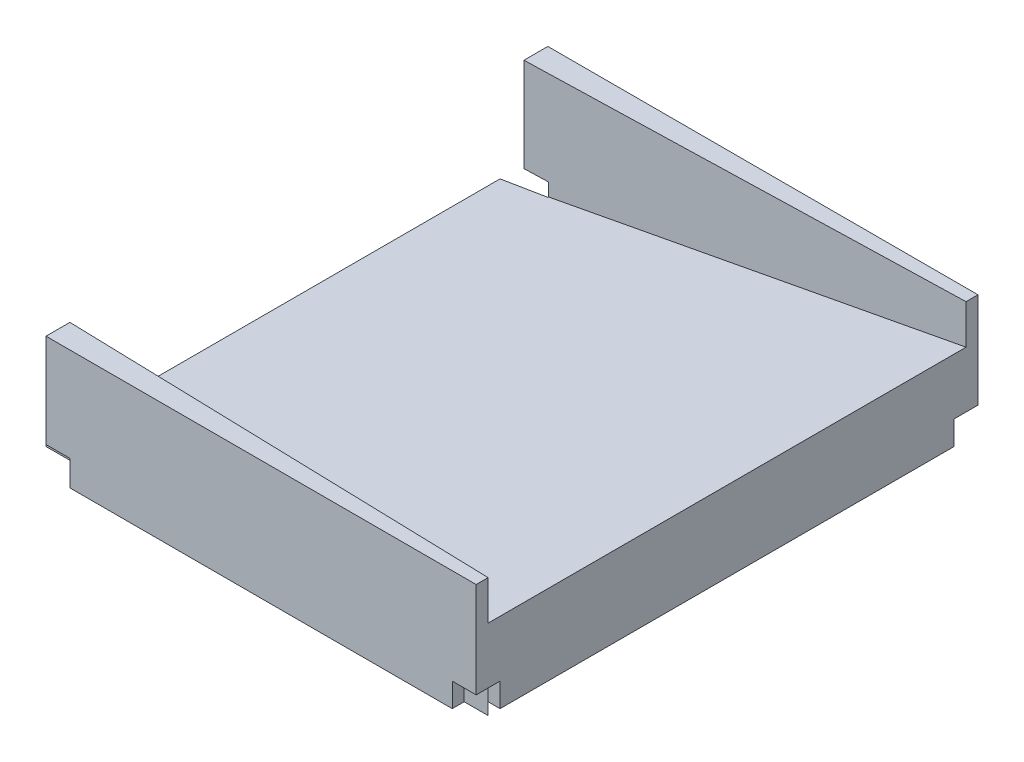
ISO-10303-21;
HEADER;
FILE_DESCRIPTION(('STEP AP214'),'2;1');
FILE_NAME('part.step','',(''),(''),'','','');
FILE_SCHEMA(('AUTOMOTIVE_DESIGN { 1 0 10303 214 1 1 1 1 }'));
ENDSEC;
DATA;
#1=APPLICATION_CONTEXT('core data for automotive mechanical design processes');
#2=APPLICATION_PROTOCOL_DEFINITION('international standard','automotive_design',2000,#1);
#3=PRODUCT_CONTEXT('',#1,'mechanical');
#4=PRODUCT('Part','Part','',(#3));
#5=PRODUCT_RELATED_PRODUCT_CATEGORY('part','',(#4));
#6=PRODUCT_DEFINITION_FORMATION('','',#4);
#7=PRODUCT_DEFINITION_CONTEXT('part definition',#1,'design');
#8=PRODUCT_DEFINITION('design','',#6,#7);
#9=PRODUCT_DEFINITION_SHAPE('','',#8);
#10=(LENGTH_UNIT() NAMED_UNIT(*) SI_UNIT(.MILLI.,.METRE.));
#11=(NAMED_UNIT(*) PLANE_ANGLE_UNIT() SI_UNIT($,.RADIAN.));
#12=(NAMED_UNIT(*) SI_UNIT($,.STERADIAN.) SOLID_ANGLE_UNIT());
#13=UNCERTAINTY_MEASURE_WITH_UNIT(LENGTH_MEASURE(1.E-05),#10,'distance_accuracy_value','');
#14=(GEOMETRIC_REPRESENTATION_CONTEXT(3) GLOBAL_UNCERTAINTY_ASSIGNED_CONTEXT((#13)) GLOBAL_UNIT_ASSIGNED_CONTEXT((#10,
#11,#12)) REPRESENTATION_CONTEXT('',''));
#15=CARTESIAN_POINT('',(0.,0.,0.));
#16=DIRECTION('',(0.,0.,1.));
#17=DIRECTION('',(1.,0.,0.));
#18=AXIS2_PLACEMENT_3D('',#15,#16,#17);
#19=CARTESIAN_POINT('',(-105.796013404709,2.,200.));
#20=DIRECTION('',(0.163567680624933,-0.986532114963816,0.));
#21=DIRECTION('',(0.986532114963816,0.163567680624933,0.));
#22=AXIS2_PLACEMENT_3D('',#19,#20,#21);
#23=PLANE('',#22);
#24=DIRECTION('',(0.,0.,-1.));
#25=VECTOR('',#24,1.);
#26=CARTESIAN_POINT('',(-85.7960134047091,5.31601329837969,200.));
#27=LINE('',#26,#25);
#28=CARTESIAN_POINT('',(-85.7960134047091,5.31601329837969,195.277777777778));
#29=VERTEX_POINT('',#28);
#30=CARTESIAN_POINT('',(-85.7960134047091,5.31601329837969,195.));
#31=VERTEX_POINT('',#30);
#32=EDGE_CURVE('E252',#29,#31,#27,.T.);
#33=ORIENTED_EDGE('',*,*,#32,.F.);
#34=DIRECTION('',(-0.986161899831777,-0.163506298709877,-0.0273933861064383));
#35=VECTOR('',#34,1.);
#36=CARTESIAN_POINT('',(-105.653437860258,2.02363912007125,194.726182654013));
#37=LINE('',#36,#35);
#38=CARTESIAN_POINT('',(84.2039865952909,33.502126334607,200.));
#39=VERTEX_POINT('',#38);
#40=EDGE_CURVE('E257',#39,#29,#37,.T.);
#41=ORIENTED_EDGE('',*,*,#40,.F.);
#42=DIRECTION('',(0.,0.,-1.));
#43=VECTOR('',#42,1.);
#44=CARTESIAN_POINT('',(84.2039865952909,33.502126334607,200.));
#45=LINE('',#44,#43);
#46=CARTESIAN_POINT('',(84.2039865952909,33.502126334607,0.));
#47=VERTEX_POINT('',#46);
#48=EDGE_CURVE('E233',#39,#47,#45,.T.);
#49=ORIENTED_EDGE('',*,*,#48,.T.);
#50=DIRECTION('',(-0.986161899831777,-0.163506298709877,0.0273933861064383));
#51=VECTOR('',#50,1.);
#52=CARTESIAN_POINT('',(-111.056300597368,1.12784088579239,5.42389686646275));
#53=LINE('',#52,#51);
#54=CARTESIAN_POINT('',(-85.7960134047091,5.31601329837969,4.72222222222223));
#55=VERTEX_POINT('',#54);
#56=EDGE_CURVE('E353',#47,#55,#53,.T.);
#57=ORIENTED_EDGE('',*,*,#56,.T.);
#58=DIRECTION('',(0.,0.,1.));
#59=VECTOR('',#58,1.);
#60=CARTESIAN_POINT('',(-85.7960134047091,5.31601329837969,200.));
#61=LINE('',#60,#59);
#62=CARTESIAN_POINT('',(-85.7960134047091,5.31601329837969,5.));
#63=VERTEX_POINT('',#62);
#64=EDGE_CURVE('E294',#55,#63,#61,.T.);
#65=ORIENTED_EDGE('',*,*,#64,.T.);
#66=DIRECTION('',(0.986532114963816,0.163567680624933,0.));
#67=VECTOR('',#66,1.);
#68=CARTESIAN_POINT('',(-105.796013404709,2.,5.));
#69=LINE('',#68,#67);
#70=CARTESIAN_POINT('',(-105.796013404709,2.,5.));
#71=VERTEX_POINT('',#70);
#72=EDGE_CURVE('E289',#71,#63,#69,.T.);
#73=ORIENTED_EDGE('',*,*,#72,.F.);
#74=DIRECTION('',(0.,0.,-1.));
#75=VECTOR('',#74,1.);
#76=CARTESIAN_POINT('',(-105.796013404709,2.,200.));
#77=LINE('',#76,#75);
#78=CARTESIAN_POINT('',(-105.796013404709,2.,195.));
#79=VERTEX_POINT('',#78);
#80=EDGE_CURVE('E239',#79,#71,#77,.T.);
#81=ORIENTED_EDGE('',*,*,#80,.F.);
#82=DIRECTION('',(-0.986532114963816,-0.163567680624933,0.));
#83=VECTOR('',#82,1.);
#84=CARTESIAN_POINT('',(-105.796013404709,2.,195.));
#85=LINE('',#84,#83);
#86=EDGE_CURVE('E209',#31,#79,#85,.T.);
#87=ORIENTED_EDGE('',*,*,#86,.F.);
#88=EDGE_LOOP('',(#33,#41,#49,#57,#65,#73,#81,#87));
#89=FACE_BOUND('',#88,.T.);
#90=ADVANCED_FACE('F35',(#89),#23,.F.);
#91=CARTESIAN_POINT('',(-105.796013404709,0.,200.));
#92=DIRECTION('',(1.,0.,0.));
#93=DIRECTION('',(0.,0.,-1.));
#94=AXIS2_PLACEMENT_3D('',#91,#92,#93);
#95=PLANE('',#94);
#96=DIRECTION('',(0.,1.,0.));
#97=VECTOR('',#96,1.);
#98=CARTESIAN_POINT('',(-105.796013404709,0.,195.));
#99=LINE('',#98,#97);
#100=CARTESIAN_POINT('',(-105.796013404709,0.,195.));
#101=VERTEX_POINT('',#100);
#102=EDGE_CURVE('E202',#101,#79,#99,.T.);
#103=ORIENTED_EDGE('',*,*,#102,.T.);
#104=ORIENTED_EDGE('',*,*,#80,.T.);
#105=DIRECTION('',(0.,1.,0.));
#106=VECTOR('',#105,1.);
#107=CARTESIAN_POINT('',(-105.796013404709,0.,5.));
#108=LINE('',#107,#106);
#109=CARTESIAN_POINT('',(-105.796013404709,0.,5.));
#110=VERTEX_POINT('',#109);
#111=EDGE_CURVE('E226',#110,#71,#108,.T.);
#112=ORIENTED_EDGE('',*,*,#111,.F.);
#113=DIRECTION('',(0.,0.,-1.));
#114=VECTOR('',#113,1.);
#115=CARTESIAN_POINT('',(-105.796013404709,0.,200.));
#116=LINE('',#115,#114);
#117=EDGE_CURVE('E218',#101,#110,#116,.T.);
#118=ORIENTED_EDGE('',*,*,#117,.F.);
#119=EDGE_LOOP('',(#103,#104,#112,#118));
#120=FACE_BOUND('',#119,.T.);
#121=ADVANCED_FACE('F37',(#120),#95,.F.);
#122=CARTESIAN_POINT('',(-105.796013404709,0.,200.));
#123=DIRECTION('',(0.,1.,0.));
#124=DIRECTION('',(0.,0.,1.));
#125=AXIS2_PLACEMENT_3D('',#122,#123,#124);
#126=PLANE('',#125);
#127=DIRECTION('',(0.,0.,1.));
#128=VECTOR('',#127,1.);
#129=CARTESIAN_POINT('',(-85.7960134047091,0.,195.));
#130=LINE('',#129,#128);
#131=CARTESIAN_POINT('',(-85.7960134047091,0.,195.));
#132=VERTEX_POINT('',#131);
#133=CARTESIAN_POINT('',(-85.7960134047091,0.,205.));
#134=VERTEX_POINT('',#133);
#135=EDGE_CURVE('E221',#132,#134,#130,.T.);
#136=ORIENTED_EDGE('',*,*,#135,.F.);
#137=DIRECTION('',(-1.,0.,0.));
#138=VECTOR('',#137,1.);
#139=CARTESIAN_POINT('',(-105.796013404709,0.,195.));
#140=LINE('',#139,#138);
#141=EDGE_CURVE('E206',#132,#101,#140,.T.);
#142=ORIENTED_EDGE('',*,*,#141,.T.);
#143=ORIENTED_EDGE('',*,*,#117,.T.);
#144=DIRECTION('',(-1.,0.,0.));
#145=VECTOR('',#144,1.);
#146=CARTESIAN_POINT('',(-105.796013404709,0.,5.));
#147=LINE('',#146,#145);
#148=CARTESIAN_POINT('',(-85.7960134047091,0.,5.));
#149=VERTEX_POINT('',#148);
#150=EDGE_CURVE('E280',#149,#110,#147,.T.);
#151=ORIENTED_EDGE('',*,*,#150,.F.);
#152=DIRECTION('',(0.,0.,-1.));
#153=VECTOR('',#152,1.);
#154=CARTESIAN_POINT('',(-85.7960134047091,0.,5.));
#155=LINE('',#154,#153);
#156=CARTESIAN_POINT('',(-85.7960134047091,0.,-5.));
#157=VERTEX_POINT('',#156);
#158=EDGE_CURVE('E286',#149,#157,#155,.T.);
#159=ORIENTED_EDGE('',*,*,#158,.T.);
#160=DIRECTION('',(1.,0.,0.));
#161=VECTOR('',#160,1.);
#162=CARTESIAN_POINT('',(-95.7960134047091,0.,-5.));
#163=LINE('',#162,#161);
#164=CARTESIAN_POINT('',(74.2039865952908,0.,-5.));
#165=VERTEX_POINT('',#164);
#166=EDGE_CURVE('E365',#157,#165,#163,.T.);
#167=ORIENTED_EDGE('',*,*,#166,.T.);
#168=DIRECTION('',(0.,0.,-1.));
#169=VECTOR('',#168,1.);
#170=CARTESIAN_POINT('',(74.2039865952909,0.,-5.));
#171=LINE('',#170,#169);
#172=CARTESIAN_POINT('',(74.2039865952909,0.,5.));
#173=VERTEX_POINT('',#172);
#174=EDGE_CURVE('E308',#173,#165,#171,.T.);
#175=ORIENTED_EDGE('',*,*,#174,.F.);
#176=DIRECTION('',(1.,0.,0.));
#177=VECTOR('',#176,1.);
#178=CARTESIAN_POINT('',(74.2039865952909,0.,5.));
#179=LINE('',#178,#177);
#180=CARTESIAN_POINT('',(84.2039865952909,0.,5.));
#181=VERTEX_POINT('',#180);
#182=EDGE_CURVE('E315',#173,#181,#179,.T.);
#183=ORIENTED_EDGE('',*,*,#182,.T.);
#184=DIRECTION('',(0.,0.,-1.));
#185=VECTOR('',#184,1.);
#186=CARTESIAN_POINT('',(84.2039865952909,0.,200.));
#187=LINE('',#186,#185);
#188=CARTESIAN_POINT('',(84.2039865952909,0.,195.));
#189=VERTEX_POINT('',#188);
#190=EDGE_CURVE('E228',#189,#181,#187,.T.);
#191=ORIENTED_EDGE('',*,*,#190,.F.);
#192=DIRECTION('',(1.,0.,0.));
#193=VECTOR('',#192,1.);
#194=CARTESIAN_POINT('',(74.2039865952909,0.,195.));
#195=LINE('',#194,#193);
#196=CARTESIAN_POINT('',(74.2039865952909,0.,195.));
#197=VERTEX_POINT('',#196);
#198=EDGE_CURVE('E336',#197,#189,#195,.T.);
#199=ORIENTED_EDGE('',*,*,#198,.F.);
#200=DIRECTION('',(0.,0.,-1.));
#201=VECTOR('',#200,1.);
#202=CARTESIAN_POINT('',(74.2039865952909,0.,205.));
#203=LINE('',#202,#201);
#204=CARTESIAN_POINT('',(74.2039865952909,0.,199.722222222222));
#205=VERTEX_POINT('',#204);
#206=EDGE_CURVE('E325',#205,#197,#203,.T.);
#207=ORIENTED_EDGE('',*,*,#206,.F.);
#208=DIRECTION('',(-0.999614420652718,0.,-0.0277670672403533));
#209=VECTOR('',#208,1.);
#210=CARTESIAN_POINT('',(-95.7960134047091,0.,195.));
#211=LINE('',#210,#209);
#212=CARTESIAN_POINT('',(84.2039865952909,0.,200.));
#213=VERTEX_POINT('',#212);
#214=EDGE_CURVE('E270',#213,#205,#211,.T.);
#215=ORIENTED_EDGE('',*,*,#214,.F.);
#216=DIRECTION('',(1.,0.,0.));
#217=VECTOR('',#216,1.);
#218=CARTESIAN_POINT('',(84.2039865952909,0.,200.));
#219=LINE('',#218,#217);
#220=CARTESIAN_POINT('',(74.2039865952909,0.,200.));
#221=VERTEX_POINT('',#220);
#222=EDGE_CURVE('E414',#221,#213,#219,.T.);
#223=ORIENTED_EDGE('',*,*,#222,.F.);
#224=CARTESIAN_POINT('',(74.2039865952909,0.,205.));
#225=VERTEX_POINT('',#224);
#226=EDGE_CURVE('E327',#225,#221,#203,.T.);
#227=ORIENTED_EDGE('',*,*,#226,.F.);
#228=DIRECTION('',(1.,0.,0.));
#229=VECTOR('',#228,1.);
#230=CARTESIAN_POINT('',(-95.7960134047091,0.,205.));
#231=LINE('',#230,#229);
#232=EDGE_CURVE('E390',#134,#225,#231,.T.);
#233=ORIENTED_EDGE('',*,*,#232,.F.);
#234=EDGE_LOOP('',(#136,#142,#143,#151,#159,#167,#175,#183,#191,#199,#207,#215,#223,#227,#233));
#235=FACE_BOUND('',#234,.T.);
#236=ADVANCED_FACE('F216',(#235),#126,.F.);
#237=CARTESIAN_POINT('',(-95.7960134047091,0.,205.));
#238=DIRECTION('',(0.,0.,1.));
#239=DIRECTION('',(1.,0.,0.));
#240=AXIS2_PLACEMENT_3D('',#237,#238,#239);
#241=PLANE('',#240);
#242=DIRECTION('',(0.,-1.,0.));
#243=VECTOR('',#242,1.);
#244=CARTESIAN_POINT('',(-95.7960134047091,0.,205.));
#245=LINE('',#244,#243);
#246=CARTESIAN_POINT('',(-95.7960134047091,50.,205.));
#247=VERTEX_POINT('',#246);
#248=CARTESIAN_POINT('',(-95.7960134047091,10.7198341627884,205.));
#249=VERTEX_POINT('',#248);
#250=EDGE_CURVE('E377',#247,#249,#245,.T.);
#251=ORIENTED_EDGE('',*,*,#250,.T.);
#252=DIRECTION('',(1.,0.,0.));
#253=VECTOR('',#252,1.);
#254=CARTESIAN_POINT('',(-105.796013404709,10.7198341627884,205.));
#255=LINE('',#254,#253);
#256=CARTESIAN_POINT('',(-85.7960134047091,10.7198341627884,205.));
#257=VERTEX_POINT('',#256);
#258=EDGE_CURVE('E213',#249,#257,#255,.T.);
#259=ORIENTED_EDGE('',*,*,#258,.T.);
#260=DIRECTION('',(0.,-1.,0.));
#261=VECTOR('',#260,1.);
#262=CARTESIAN_POINT('',(-85.7960134047091,0.,205.));
#263=LINE('',#262,#261);
#264=EDGE_CURVE('E426',#257,#134,#263,.T.);
#265=ORIENTED_EDGE('',*,*,#264,.T.);
#266=ORIENTED_EDGE('',*,*,#232,.T.);
#267=DIRECTION('',(0.,-1.,0.));
#268=VECTOR('',#267,1.);
#269=CARTESIAN_POINT('',(74.2039865952909,0.,205.));
#270=LINE('',#269,#268);
#271=CARTESIAN_POINT('',(74.2039865952909,10.,205.));
#272=VERTEX_POINT('',#271);
#273=EDGE_CURVE('E322',#272,#225,#270,.T.);
#274=ORIENTED_EDGE('',*,*,#273,.F.);
#275=DIRECTION('',(1.,0.,0.));
#276=VECTOR('',#275,1.);
#277=CARTESIAN_POINT('',(74.2039865952909,10.,205.));
#278=LINE('',#277,#276);
#279=CARTESIAN_POINT('',(84.2039865952909,10.,205.));
#280=VERTEX_POINT('',#279);
#281=EDGE_CURVE('E342',#272,#280,#278,.T.);
#282=ORIENTED_EDGE('',*,*,#281,.T.);
#283=DIRECTION('',(0.,-1.,0.));
#284=VECTOR('',#283,1.);
#285=CARTESIAN_POINT('',(84.2039865952909,0.,205.));
#286=LINE('',#285,#284);
#287=CARTESIAN_POINT('',(84.2039865952909,50.,205.));
#288=VERTEX_POINT('',#287);
#289=EDGE_CURVE('E378',#288,#280,#286,.T.);
#290=ORIENTED_EDGE('',*,*,#289,.F.);
#291=DIRECTION('',(1.,0.,0.));
#292=VECTOR('',#291,1.);
#293=CARTESIAN_POINT('',(-95.7960134047091,50.,205.));
#294=LINE('',#293,#292);
#295=EDGE_CURVE('E381',#247,#288,#294,.T.);
#296=ORIENTED_EDGE('',*,*,#295,.F.);
#297=EDGE_LOOP('',(#251,#259,#265,#266,#274,#282,#290,#296));
#298=FACE_BOUND('',#297,.T.);
#299=ADVANCED_FACE('F428',(#298),#241,.T.);
#300=CARTESIAN_POINT('',(-95.7960134047091,0.,0.));
#301=DIRECTION('',(1.,0.,0.));
#302=DIRECTION('',(0.,0.,-1.));
#303=AXIS2_PLACEMENT_3D('',#300,#301,#302);
#304=PLANE('',#303);
#305=DIRECTION('',(0.,0.,-1.));
#306=VECTOR('',#305,1.);
#307=CARTESIAN_POINT('',(-95.7960134047091,10.7198341627884,0.));
#308=LINE('',#307,#306);
#309=CARTESIAN_POINT('',(-95.7960134047091,10.7198341627884,195.));
#310=VERTEX_POINT('',#309);
#311=EDGE_CURVE('E259',#249,#310,#308,.T.);
#312=ORIENTED_EDGE('',*,*,#311,.F.);
#313=ORIENTED_EDGE('',*,*,#250,.F.);
#314=DIRECTION('',(0.,0.,1.));
#315=VECTOR('',#314,1.);
#316=CARTESIAN_POINT('',(-95.7960134047091,50.,200.));
#317=LINE('',#316,#315);
#318=CARTESIAN_POINT('',(-95.7960134047091,50.,195.));
#319=VERTEX_POINT('',#318);
#320=EDGE_CURVE('E374',#319,#247,#317,.T.);
#321=ORIENTED_EDGE('',*,*,#320,.F.);
#322=DIRECTION('',(0.,1.,0.));
#323=VECTOR('',#322,1.);
#324=CARTESIAN_POINT('',(-95.7960134047091,-180.069431053691,195.));
#325=LINE('',#324,#323);
#326=EDGE_CURVE('E405',#310,#319,#325,.T.);
#327=ORIENTED_EDGE('',*,*,#326,.F.);
#328=EDGE_LOOP('',(#312,#313,#321,#327));
#329=FACE_BOUND('',#328,.T.);
#330=ADVANCED_FACE('F461',(#329),#304,.F.);
#331=CARTESIAN_POINT('',(-95.7960134047091,-180.069431053691,195.));
#332=DIRECTION('',(-0.0277670672403533,0.,0.999614420652718));
#333=DIRECTION('',(0.999614420652718,0.,0.0277670672403533));
#334=AXIS2_PLACEMENT_3D('',#331,#332,#333);
#335=PLANE('',#334);
#336=DIRECTION('',(0.999614420652718,0.,0.0277670672403533));
#337=VECTOR('',#336,1.);
#338=CARTESIAN_POINT('',(-95.7960134047091,10.7198341627884,195.));
#339=LINE('',#338,#337);
#340=CARTESIAN_POINT('',(-85.7960134047091,10.7198341627884,195.277777777778));
#341=VERTEX_POINT('',#340);
#342=EDGE_CURVE('E11',#310,#341,#339,.T.);
#343=ORIENTED_EDGE('',*,*,#342,.F.);
#344=ORIENTED_EDGE('',*,*,#326,.T.);
#345=DIRECTION('',(0.999614420652718,0.,0.0277670672403533));
#346=VECTOR('',#345,1.);
#347=CARTESIAN_POINT('',(-95.7960134047091,50.,195.));
#348=LINE('',#347,#346);
#349=CARTESIAN_POINT('',(84.2039865952909,50.,200.));
#350=VERTEX_POINT('',#349);
#351=EDGE_CURVE('E403',#319,#350,#348,.T.);
#352=ORIENTED_EDGE('',*,*,#351,.T.);
#353=DIRECTION('',(0.,1.,0.));
#354=VECTOR('',#353,1.);
#355=CARTESIAN_POINT('',(84.2039865952909,0.,200.));
#356=LINE('',#355,#354);
#357=EDGE_CURVE('E264',#39,#350,#356,.T.);
#358=ORIENTED_EDGE('',*,*,#357,.F.);
#359=ORIENTED_EDGE('',*,*,#40,.T.);
#360=DIRECTION('',(0.,-1.,0.));
#361=VECTOR('',#360,1.);
#362=CARTESIAN_POINT('',(-85.7960134047091,-180.069431053691,195.277777777778));
#363=LINE('',#362,#361);
#364=EDGE_CURVE('E43',#341,#29,#363,.T.);
#365=ORIENTED_EDGE('',*,*,#364,.F.);
#366=EDGE_LOOP('',(#343,#344,#352,#358,#359,#365));
#367=FACE_BOUND('',#366,.T.);
#368=ADVANCED_FACE('F262',(#367),#335,.F.);
#369=CARTESIAN_POINT('',(74.2039865952909,10.,205.));
#370=DIRECTION('',(0.,1.,0.));
#371=DIRECTION('',(0.,0.,1.));
#372=AXIS2_PLACEMENT_3D('',#369,#370,#371);
#373=PLANE('',#372);
#374=DIRECTION('',(-1.,0.,0.));
#375=VECTOR('',#374,1.);
#376=CARTESIAN_POINT('',(74.2039865952909,10.,200.));
#377=LINE('',#376,#375);
#378=CARTESIAN_POINT('',(84.2039865952909,10.,200.));
#379=VERTEX_POINT('',#378);
#380=CARTESIAN_POINT('',(74.2039865952909,10.,200.));
#381=VERTEX_POINT('',#380);
#382=EDGE_CURVE('E57',#379,#381,#377,.T.);
#383=ORIENTED_EDGE('',*,*,#382,.F.);
#384=DIRECTION('',(0.,0.,1.));
#385=VECTOR('',#384,1.);
#386=CARTESIAN_POINT('',(84.2039865952909,10.,205.));
#387=LINE('',#386,#385);
#388=EDGE_CURVE('E339',#379,#280,#387,.T.);
#389=ORIENTED_EDGE('',*,*,#388,.T.);
#390=ORIENTED_EDGE('',*,*,#281,.F.);
#391=DIRECTION('',(0.,0.,1.));
#392=VECTOR('',#391,1.);
#393=CARTESIAN_POINT('',(74.2039865952909,10.,205.));
#394=LINE('',#393,#392);
#395=EDGE_CURVE('E332',#381,#272,#394,.T.);
#396=ORIENTED_EDGE('',*,*,#395,.F.);
#397=EDGE_LOOP('',(#383,#389,#390,#396));
#398=FACE_BOUND('',#397,.T.);
#399=ADVANCED_FACE('F489',(#398),#373,.F.);
#400=DIRECTION('',(0.999614420652718,0.,0.0277670672403533));
#401=VECTOR('',#400,1.);
#402=CARTESIAN_POINT('',(74.3504784996857,10.,199.726291441789));
#403=LINE('',#402,#401);
#404=CARTESIAN_POINT('',(74.2039865952909,10.,199.722222222222));
#405=VERTEX_POINT('',#404);
#406=EDGE_CURVE('E265',#405,#379,#403,.T.);
#407=ORIENTED_EDGE('',*,*,#406,.F.);
#408=CARTESIAN_POINT('',(74.2039865952909,10.,195.));
#409=VERTEX_POINT('',#408);
#410=EDGE_CURVE('E333',#409,#405,#394,.T.);
#411=ORIENTED_EDGE('',*,*,#410,.F.);
#412=DIRECTION('',(1.,0.,0.));
#413=VECTOR('',#412,1.);
#414=CARTESIAN_POINT('',(74.2039865952909,10.,195.));
#415=LINE('',#414,#413);
#416=CARTESIAN_POINT('',(84.2039865952909,10.,195.));
#417=VERTEX_POINT('',#416);
#418=EDGE_CURVE('E346',#409,#417,#415,.T.);
#419=ORIENTED_EDGE('',*,*,#418,.T.);
#420=EDGE_CURVE('E326',#417,#379,#387,.T.);
#421=ORIENTED_EDGE('',*,*,#420,.T.);
#422=EDGE_LOOP('',(#407,#411,#419,#421));
#423=FACE_BOUND('',#422,.T.);
#424=ADVANCED_FACE('F492',(#423),#373,.F.);
#425=CARTESIAN_POINT('',(74.2039865952909,0.,0.));
#426=DIRECTION('',(-1.,0.,0.));
#427=DIRECTION('',(0.,0.,1.));
#428=AXIS2_PLACEMENT_3D('',#425,#426,#427);
#429=PLANE('',#428);
#430=DIRECTION('',(0.,-1.,0.));
#431=VECTOR('',#430,1.);
#432=CARTESIAN_POINT('',(74.2039865952909,0.,200.));
#433=LINE('',#432,#431);
#434=EDGE_CURVE('E247',#381,#221,#433,.T.);
#435=ORIENTED_EDGE('',*,*,#434,.F.);
#436=ORIENTED_EDGE('',*,*,#395,.T.);
#437=ORIENTED_EDGE('',*,*,#273,.T.);
#438=ORIENTED_EDGE('',*,*,#226,.T.);
#439=EDGE_LOOP('',(#435,#436,#437,#438));
#440=FACE_BOUND('',#439,.T.);
#441=ADVANCED_FACE('F431',(#440),#429,.F.);
#442=DIRECTION('',(0.,1.,0.));
#443=VECTOR('',#442,1.);
#444=CARTESIAN_POINT('',(74.2039865952909,0.,199.722222222222));
#445=LINE('',#444,#443);
#446=EDGE_CURVE('E244',#205,#405,#445,.T.);
#447=ORIENTED_EDGE('',*,*,#446,.F.);
#448=ORIENTED_EDGE('',*,*,#206,.T.);
#449=DIRECTION('',(0.,1.,0.));
#450=VECTOR('',#449,1.);
#451=CARTESIAN_POINT('',(74.2039865952909,0.,195.));
#452=LINE('',#451,#450);
#453=EDGE_CURVE('E329',#197,#409,#452,.T.);
#454=ORIENTED_EDGE('',*,*,#453,.T.);
#455=ORIENTED_EDGE('',*,*,#410,.T.);
#456=EDGE_LOOP('',(#447,#448,#454,#455));
#457=FACE_BOUND('',#456,.T.);
#458=ADVANCED_FACE('F456',(#457),#429,.F.);
#459=CARTESIAN_POINT('',(84.2039865952909,0.,200.));
#460=DIRECTION('',(-1.,0.,0.));
#461=DIRECTION('',(0.,0.,1.));
#462=AXIS2_PLACEMENT_3D('',#459,#460,#461);
#463=PLANE('',#462);
#464=ORIENTED_EDGE('',*,*,#388,.F.);
#465=ORIENTED_EDGE('',*,*,#420,.F.);
#466=DIRECTION('',(0.,1.,0.));
#467=VECTOR('',#466,1.);
#468=CARTESIAN_POINT('',(84.2039865952909,0.,195.));
#469=LINE('',#468,#467);
#470=EDGE_CURVE('E318',#189,#417,#469,.T.);
#471=ORIENTED_EDGE('',*,*,#470,.F.);
#472=ORIENTED_EDGE('',*,*,#190,.T.);
#473=DIRECTION('',(0.,-1.,0.));
#474=VECTOR('',#473,1.);
#475=CARTESIAN_POINT('',(84.2039865952909,0.,5.));
#476=LINE('',#475,#474);
#477=CARTESIAN_POINT('',(84.2039865952909,10.,5.));
#478=VERTEX_POINT('',#477);
#479=EDGE_CURVE('E302',#478,#181,#476,.T.);
#480=ORIENTED_EDGE('',*,*,#479,.F.);
#481=DIRECTION('',(0.,0.,1.));
#482=VECTOR('',#481,1.);
#483=CARTESIAN_POINT('',(84.2039865952909,10.,-5.));
#484=LINE('',#483,#482);
#485=CARTESIAN_POINT('',(84.2039865952909,10.,-5.));
#486=VERTEX_POINT('',#485);
#487=EDGE_CURVE('E297',#486,#478,#484,.T.);
#488=ORIENTED_EDGE('',*,*,#487,.F.);
#489=DIRECTION('',(0.,1.,0.));
#490=VECTOR('',#489,1.);
#491=CARTESIAN_POINT('',(84.2039865952909,0.,-5.));
#492=LINE('',#491,#490);
#493=CARTESIAN_POINT('',(84.2039865952909,50.,-5.));
#494=VERTEX_POINT('',#493);
#495=EDGE_CURVE('E368',#486,#494,#492,.T.);
#496=ORIENTED_EDGE('',*,*,#495,.T.);
#497=DIRECTION('',(0.,0.,1.));
#498=VECTOR('',#497,1.);
#499=CARTESIAN_POINT('',(84.2039865952909,50.,0.));
#500=LINE('',#499,#498);
#501=CARTESIAN_POINT('',(84.2039865952909,50.,0.));
#502=VERTEX_POINT('',#501);
#503=EDGE_CURVE('E362',#494,#502,#500,.T.);
#504=ORIENTED_EDGE('',*,*,#503,.T.);
#505=DIRECTION('',(0.,-1.,0.));
#506=VECTOR('',#505,1.);
#507=CARTESIAN_POINT('',(84.2039865952909,0.,0.));
#508=LINE('',#507,#506);
#509=EDGE_CURVE('E356',#502,#47,#508,.T.);
#510=ORIENTED_EDGE('',*,*,#509,.T.);
#511=ORIENTED_EDGE('',*,*,#48,.F.);
#512=ORIENTED_EDGE('',*,*,#357,.T.);
#513=DIRECTION('',(0.,0.,1.));
#514=VECTOR('',#513,1.);
#515=CARTESIAN_POINT('',(84.2039865952909,50.,200.));
#516=LINE('',#515,#514);
#517=EDGE_CURVE('E384',#350,#288,#516,.T.);
#518=ORIENTED_EDGE('',*,*,#517,.T.);
#519=ORIENTED_EDGE('',*,*,#289,.T.);
#520=EDGE_LOOP('',(#464,#465,#471,#472,#480,#488,#496,#504,#510,#511,#512,#518,#519));
#521=FACE_BOUND('',#520,.T.);
#522=ADVANCED_FACE('F399',(#521),#463,.F.);
#523=CARTESIAN_POINT('',(-95.7960134047091,50.,200.));
#524=DIRECTION('',(0.,1.,0.));
#525=DIRECTION('',(0.,0.,1.));
#526=AXIS2_PLACEMENT_3D('',#523,#524,#525);
#527=PLANE('',#526);
#528=ORIENTED_EDGE('',*,*,#517,.F.);
#529=ORIENTED_EDGE('',*,*,#351,.F.);
#530=ORIENTED_EDGE('',*,*,#320,.T.);
#531=ORIENTED_EDGE('',*,*,#295,.T.);
#532=EDGE_LOOP('',(#528,#529,#530,#531));
#533=FACE_BOUND('',#532,.T.);
#534=ADVANCED_FACE('F402',(#533),#527,.T.);
#535=CARTESIAN_POINT('',(-95.7960134047091,50.,0.));
#536=DIRECTION('',(0.,1.,0.));
#537=DIRECTION('',(0.,0.,1.));
#538=AXIS2_PLACEMENT_3D('',#535,#536,#537);
#539=PLANE('',#538);
#540=ORIENTED_EDGE('',*,*,#503,.F.);
#541=DIRECTION('',(1.,0.,0.));
#542=VECTOR('',#541,1.);
#543=CARTESIAN_POINT('',(-95.7960134047091,50.,-5.));
#544=LINE('',#543,#542);
#545=CARTESIAN_POINT('',(-95.7960134047091,50.,-5.));
#546=VERTEX_POINT('',#545);
#547=EDGE_CURVE('E388',#546,#494,#544,.T.);
#548=ORIENTED_EDGE('',*,*,#547,.F.);
#549=DIRECTION('',(0.,0.,1.));
#550=VECTOR('',#549,1.);
#551=CARTESIAN_POINT('',(-95.7960134047091,50.,0.));
#552=LINE('',#551,#550);
#553=CARTESIAN_POINT('',(-95.7960134047091,50.,5.));
#554=VERTEX_POINT('',#553);
#555=EDGE_CURVE('E361',#546,#554,#552,.T.);
#556=ORIENTED_EDGE('',*,*,#555,.T.);
#557=DIRECTION('',(0.999614420652718,0.,-0.0277670672403533));
#558=VECTOR('',#557,1.);
#559=CARTESIAN_POINT('',(-95.7960134047091,50.,5.));
#560=LINE('',#559,#558);
#561=EDGE_CURVE('E345',#554,#502,#560,.T.);
#562=ORIENTED_EDGE('',*,*,#561,.T.);
#563=EDGE_LOOP('',(#540,#548,#556,#562));
#564=FACE_BOUND('',#563,.T.);
#565=ADVANCED_FACE('F472',(#564),#539,.T.);
#566=CARTESIAN_POINT('',(-95.7960134047091,0.,-5.));
#567=DIRECTION('',(0.,0.,-1.));
#568=DIRECTION('',(-1.,0.,0.));
#569=AXIS2_PLACEMENT_3D('',#566,#567,#568);
#570=PLANE('',#569);
#571=DIRECTION('',(0.,-1.,0.));
#572=VECTOR('',#571,1.);
#573=CARTESIAN_POINT('',(-85.7960134047091,0.,-5.));
#574=LINE('',#573,#572);
#575=CARTESIAN_POINT('',(-85.7960134047091,10.7198341627884,-5.));
#576=VERTEX_POINT('',#575);
#577=EDGE_CURVE('E278',#576,#157,#574,.T.);
#578=ORIENTED_EDGE('',*,*,#577,.F.);
#579=DIRECTION('',(1.,0.,0.));
#580=VECTOR('',#579,1.);
#581=CARTESIAN_POINT('',(-105.796013404709,10.7198341627884,-5.));
#582=LINE('',#581,#580);
#583=CARTESIAN_POINT('',(-95.7960134047091,10.7198341627884,-5.));
#584=VERTEX_POINT('',#583);
#585=EDGE_CURVE('E267',#584,#576,#582,.T.);
#586=ORIENTED_EDGE('',*,*,#585,.F.);
#587=DIRECTION('',(0.,1.,0.));
#588=VECTOR('',#587,1.);
#589=CARTESIAN_POINT('',(-95.7960134047091,0.,-5.));
#590=LINE('',#589,#588);
#591=EDGE_CURVE('E359',#584,#546,#590,.T.);
#592=ORIENTED_EDGE('',*,*,#591,.T.);
#593=ORIENTED_EDGE('',*,*,#547,.T.);
#594=ORIENTED_EDGE('',*,*,#495,.F.);
#595=DIRECTION('',(1.,0.,0.));
#596=VECTOR('',#595,1.);
#597=CARTESIAN_POINT('',(74.2039865952909,10.,-5.));
#598=LINE('',#597,#596);
#599=CARTESIAN_POINT('',(74.2039865952909,10.,-5.));
#600=VERTEX_POINT('',#599);
#601=EDGE_CURVE('E311',#600,#486,#598,.T.);
#602=ORIENTED_EDGE('',*,*,#601,.F.);
#603=DIRECTION('',(0.,1.,0.));
#604=VECTOR('',#603,1.);
#605=CARTESIAN_POINT('',(74.2039865952909,0.,-5.));
#606=LINE('',#605,#604);
#607=EDGE_CURVE('E298',#165,#600,#606,.T.);
#608=ORIENTED_EDGE('',*,*,#607,.F.);
#609=ORIENTED_EDGE('',*,*,#166,.F.);
#610=EDGE_LOOP('',(#578,#586,#592,#593,#594,#602,#608,#609));
#611=FACE_BOUND('',#610,.T.);
#612=ADVANCED_FACE('F468',(#611),#570,.T.);
#613=CARTESIAN_POINT('',(-95.7960134047091,0.,0.));
#614=DIRECTION('',(-1.,0.,0.));
#615=DIRECTION('',(0.,0.,1.));
#616=AXIS2_PLACEMENT_3D('',#613,#614,#615);
#617=PLANE('',#616);
#618=DIRECTION('',(0.,0.,-1.));
#619=VECTOR('',#618,1.);
#620=CARTESIAN_POINT('',(-95.7960134047091,10.7198341627884,0.));
#621=LINE('',#620,#619);
#622=CARTESIAN_POINT('',(-95.7960134047091,10.7198341627884,5.));
#623=VERTEX_POINT('',#622);
#624=EDGE_CURVE('E292',#623,#584,#621,.T.);
#625=ORIENTED_EDGE('',*,*,#624,.F.);
#626=DIRECTION('',(0.,1.,0.));
#627=VECTOR('',#626,1.);
#628=CARTESIAN_POINT('',(-95.7960134047091,-180.069431053691,5.));
#629=LINE('',#628,#627);
#630=EDGE_CURVE('E351',#623,#554,#629,.T.);
#631=ORIENTED_EDGE('',*,*,#630,.T.);
#632=ORIENTED_EDGE('',*,*,#555,.F.);
#633=ORIENTED_EDGE('',*,*,#591,.F.);
#634=EDGE_LOOP('',(#625,#631,#632,#633));
#635=FACE_BOUND('',#634,.T.);
#636=ADVANCED_FACE('F471',(#635),#617,.T.);
#637=CARTESIAN_POINT('',(-95.7960134047091,-180.069431053691,5.));
#638=DIRECTION('',(0.0277670672403533,0.,0.999614420652718));
#639=DIRECTION('',(0.999614420652718,0.,-0.0277670672403533));
#640=AXIS2_PLACEMENT_3D('',#637,#638,#639);
#641=PLANE('',#640);
#642=DIRECTION('',(0.,1.,0.));
#643=VECTOR('',#642,1.);
#644=CARTESIAN_POINT('',(-85.7960134047091,-180.069431053691,4.72222222222222));
#645=LINE('',#644,#643);
#646=CARTESIAN_POINT('',(-85.7960134047091,10.7198341627884,4.72222222222222));
#647=VERTEX_POINT('',#646);
#648=EDGE_CURVE('E230',#55,#647,#645,.T.);
#649=ORIENTED_EDGE('',*,*,#648,.F.);
#650=ORIENTED_EDGE('',*,*,#56,.F.);
#651=ORIENTED_EDGE('',*,*,#509,.F.);
#652=ORIENTED_EDGE('',*,*,#561,.F.);
#653=ORIENTED_EDGE('',*,*,#630,.F.);
#654=DIRECTION('',(-0.999614420652718,0.,0.0277670672403533));
#655=VECTOR('',#654,1.);
#656=CARTESIAN_POINT('',(-95.7960134047091,10.7198341627884,5.));
#657=LINE('',#656,#655);
#658=EDGE_CURVE('E227',#647,#623,#657,.T.);
#659=ORIENTED_EDGE('',*,*,#658,.F.);
#660=EDGE_LOOP('',(#649,#650,#651,#652,#653,#659));
#661=FACE_BOUND('',#660,.T.);
#662=ADVANCED_FACE('F479',(#661),#641,.T.);
#663=CARTESIAN_POINT('',(74.2039865952909,0.,195.));
#664=DIRECTION('',(0.,0.,-1.));
#665=DIRECTION('',(-1.,0.,0.));
#666=AXIS2_PLACEMENT_3D('',#663,#664,#665);
#667=PLANE('',#666);
#668=ORIENTED_EDGE('',*,*,#470,.T.);
#669=ORIENTED_EDGE('',*,*,#418,.F.);
#670=ORIENTED_EDGE('',*,*,#453,.F.);
#671=ORIENTED_EDGE('',*,*,#198,.T.);
#672=EDGE_LOOP('',(#668,#669,#670,#671));
#673=FACE_BOUND('',#672,.T.);
#674=ADVANCED_FACE('F483',(#673),#667,.F.);
#675=CARTESIAN_POINT('',(74.2039865952909,0.,5.));
#676=DIRECTION('',(0.,0.,1.));
#677=DIRECTION('',(1.,0.,0.));
#678=AXIS2_PLACEMENT_3D('',#675,#676,#677);
#679=PLANE('',#678);
#680=ORIENTED_EDGE('',*,*,#479,.T.);
#681=ORIENTED_EDGE('',*,*,#182,.F.);
#682=DIRECTION('',(0.,-1.,0.));
#683=VECTOR('',#682,1.);
#684=CARTESIAN_POINT('',(74.2039865952909,0.,5.));
#685=LINE('',#684,#683);
#686=CARTESIAN_POINT('',(74.2039865952909,10.,5.));
#687=VERTEX_POINT('',#686);
#688=EDGE_CURVE('E305',#687,#173,#685,.T.);
#689=ORIENTED_EDGE('',*,*,#688,.F.);
#690=DIRECTION('',(1.,0.,0.));
#691=VECTOR('',#690,1.);
#692=CARTESIAN_POINT('',(74.2039865952909,10.,5.));
#693=LINE('',#692,#691);
#694=EDGE_CURVE('E319',#687,#478,#693,.T.);
#695=ORIENTED_EDGE('',*,*,#694,.T.);
#696=EDGE_LOOP('',(#680,#681,#689,#695));
#697=FACE_BOUND('',#696,.T.);
#698=ADVANCED_FACE('F487',(#697),#679,.F.);
#699=CARTESIAN_POINT('',(74.2039865952909,10.,-5.));
#700=DIRECTION('',(0.,1.,0.));
#701=DIRECTION('',(0.,0.,1.));
#702=AXIS2_PLACEMENT_3D('',#699,#700,#701);
#703=PLANE('',#702);
#704=ORIENTED_EDGE('',*,*,#487,.T.);
#705=ORIENTED_EDGE('',*,*,#694,.F.);
#706=DIRECTION('',(0.,0.,1.));
#707=VECTOR('',#706,1.);
#708=CARTESIAN_POINT('',(74.2039865952909,10.,-5.));
#709=LINE('',#708,#707);
#710=EDGE_CURVE('E301',#600,#687,#709,.T.);
#711=ORIENTED_EDGE('',*,*,#710,.F.);
#712=ORIENTED_EDGE('',*,*,#601,.T.);
#713=EDGE_LOOP('',(#704,#705,#711,#712));
#714=FACE_BOUND('',#713,.T.);
#715=ADVANCED_FACE('F495',(#714),#703,.F.);
#716=CARTESIAN_POINT('',(74.2039865952909,0.,0.));
#717=DIRECTION('',(1.,0.,0.));
#718=DIRECTION('',(0.,0.,-1.));
#719=AXIS2_PLACEMENT_3D('',#716,#717,#718);
#720=PLANE('',#719);
#721=ORIENTED_EDGE('',*,*,#607,.T.);
#722=ORIENTED_EDGE('',*,*,#710,.T.);
#723=ORIENTED_EDGE('',*,*,#688,.T.);
#724=ORIENTED_EDGE('',*,*,#174,.T.);
#725=EDGE_LOOP('',(#721,#722,#723,#724));
#726=FACE_BOUND('',#725,.T.);
#727=ADVANCED_FACE('F498',(#726),#720,.T.);
#728=CARTESIAN_POINT('',(-85.7960134047091,0.,5.));
#729=DIRECTION('',(1.,0.,0.));
#730=DIRECTION('',(0.,0.,-1.));
#731=AXIS2_PLACEMENT_3D('',#728,#729,#730);
#732=PLANE('',#731);
#733=ORIENTED_EDGE('',*,*,#648,.T.);
#734=DIRECTION('',(0.,0.,-1.));
#735=VECTOR('',#734,1.);
#736=CARTESIAN_POINT('',(-85.7960134047091,10.7198341627884,5.));
#737=LINE('',#736,#735);
#738=EDGE_CURVE('E282',#647,#576,#737,.T.);
#739=ORIENTED_EDGE('',*,*,#738,.T.);
#740=ORIENTED_EDGE('',*,*,#577,.T.);
#741=ORIENTED_EDGE('',*,*,#158,.F.);
#742=DIRECTION('',(0.,-1.,0.));
#743=VECTOR('',#742,1.);
#744=CARTESIAN_POINT('',(-85.7960134047091,0.,5.));
#745=LINE('',#744,#743);
#746=EDGE_CURVE('E277',#63,#149,#745,.T.);
#747=ORIENTED_EDGE('',*,*,#746,.F.);
#748=ORIENTED_EDGE('',*,*,#64,.F.);
#749=EDGE_LOOP('',(#733,#739,#740,#741,#747,#748));
#750=FACE_BOUND('',#749,.T.);
#751=ADVANCED_FACE('F505',(#750),#732,.F.);
#752=CARTESIAN_POINT('',(0.,0.,5.));
#753=DIRECTION('',(0.,0.,-1.));
#754=DIRECTION('',(-1.,0.,0.));
#755=AXIS2_PLACEMENT_3D('',#752,#753,#754);
#756=PLANE('',#755);
#757=ORIENTED_EDGE('',*,*,#72,.T.);
#758=ORIENTED_EDGE('',*,*,#746,.T.);
#759=ORIENTED_EDGE('',*,*,#150,.T.);
#760=ORIENTED_EDGE('',*,*,#111,.T.);
#761=EDGE_LOOP('',(#757,#758,#759,#760));
#762=FACE_BOUND('',#761,.T.);
#763=ADVANCED_FACE('F509',(#762),#756,.T.);
#764=CARTESIAN_POINT('',(-105.796013404709,10.7198341627884,5.));
#765=DIRECTION('',(0.,1.,0.));
#766=DIRECTION('',(0.,0.,1.));
#767=AXIS2_PLACEMENT_3D('',#764,#765,#766);
#768=PLANE('',#767);
#769=ORIENTED_EDGE('',*,*,#624,.T.);
#770=ORIENTED_EDGE('',*,*,#585,.T.);
#771=ORIENTED_EDGE('',*,*,#738,.F.);
#772=ORIENTED_EDGE('',*,*,#658,.T.);
#773=EDGE_LOOP('',(#769,#770,#771,#772));
#774=FACE_BOUND('',#773,.T.);
#775=ADVANCED_FACE('F443',(#774),#768,.F.);
#776=ORIENTED_EDGE('',*,*,#446,.T.);
#777=ORIENTED_EDGE('',*,*,#406,.T.);
#778=DIRECTION('',(0.,1.,0.));
#779=VECTOR('',#778,1.);
#780=CARTESIAN_POINT('',(84.2039865952909,-180.069431053691,200.));
#781=LINE('',#780,#779);
#782=EDGE_CURVE('E408',#213,#379,#781,.T.);
#783=ORIENTED_EDGE('',*,*,#782,.F.);
#784=ORIENTED_EDGE('',*,*,#214,.T.);
#785=EDGE_LOOP('',(#776,#777,#783,#784));
#786=FACE_BOUND('',#785,.T.);
#787=ADVANCED_FACE('F435',(#786),#335,.F.);
#788=CARTESIAN_POINT('',(84.2039865952909,-180.069431053691,200.));
#789=DIRECTION('',(0.,0.,-1.));
#790=DIRECTION('',(-1.,0.,0.));
#791=AXIS2_PLACEMENT_3D('',#788,#789,#790);
#792=PLANE('',#791);
#793=ORIENTED_EDGE('',*,*,#782,.T.);
#794=ORIENTED_EDGE('',*,*,#382,.T.);
#795=ORIENTED_EDGE('',*,*,#434,.T.);
#796=ORIENTED_EDGE('',*,*,#222,.T.);
#797=EDGE_LOOP('',(#793,#794,#795,#796));
#798=FACE_BOUND('',#797,.T.);
#799=ADVANCED_FACE('F432',(#798),#792,.F.);
#800=CARTESIAN_POINT('',(-105.796013404709,10.7198341627884,195.));
#801=DIRECTION('',(0.,-1.,0.));
#802=DIRECTION('',(0.,0.,-1.));
#803=AXIS2_PLACEMENT_3D('',#800,#801,#802);
#804=PLANE('',#803);
#805=ORIENTED_EDGE('',*,*,#311,.T.);
#806=ORIENTED_EDGE('',*,*,#342,.T.);
#807=DIRECTION('',(0.,0.,1.));
#808=VECTOR('',#807,1.);
#809=CARTESIAN_POINT('',(-85.7960134047091,10.7198341627884,195.));
#810=LINE('',#809,#808);
#811=EDGE_CURVE('E50',#341,#257,#810,.T.);
#812=ORIENTED_EDGE('',*,*,#811,.T.);
#813=ORIENTED_EDGE('',*,*,#258,.F.);
#814=EDGE_LOOP('',(#805,#806,#812,#813));
#815=FACE_BOUND('',#814,.T.);
#816=ADVANCED_FACE('F434',(#815),#804,.T.);
#817=CARTESIAN_POINT('',(-85.7960134047091,0.,195.));
#818=DIRECTION('',(-1.,0.,0.));
#819=DIRECTION('',(0.,0.,1.));
#820=AXIS2_PLACEMENT_3D('',#817,#818,#819);
#821=PLANE('',#820);
#822=ORIENTED_EDGE('',*,*,#32,.T.);
#823=DIRECTION('',(0.,-1.,0.));
#824=VECTOR('',#823,1.);
#825=CARTESIAN_POINT('',(-85.7960134047091,0.,195.));
#826=LINE('',#825,#824);
#827=EDGE_CURVE('E222',#31,#132,#826,.T.);
#828=ORIENTED_EDGE('',*,*,#827,.T.);
#829=ORIENTED_EDGE('',*,*,#135,.T.);
#830=ORIENTED_EDGE('',*,*,#264,.F.);
#831=ORIENTED_EDGE('',*,*,#811,.F.);
#832=ORIENTED_EDGE('',*,*,#364,.T.);
#833=EDGE_LOOP('',(#822,#828,#829,#830,#831,#832));
#834=FACE_BOUND('',#833,.T.);
#835=ADVANCED_FACE('F251',(#834),#821,.T.);
#836=CARTESIAN_POINT('',(0.,0.,195.));
#837=DIRECTION('',(0.,0.,1.));
#838=DIRECTION('',(-1.,0.,0.));
#839=AXIS2_PLACEMENT_3D('',#836,#837,#838);
#840=PLANE('',#839);
#841=ORIENTED_EDGE('',*,*,#86,.T.);
#842=ORIENTED_EDGE('',*,*,#102,.F.);
#843=ORIENTED_EDGE('',*,*,#141,.F.);
#844=ORIENTED_EDGE('',*,*,#827,.F.);
#845=EDGE_LOOP('',(#841,#842,#843,#844));
#846=FACE_BOUND('',#845,.T.);
#847=ADVANCED_FACE('F204',(#846),#840,.T.);
#848=CLOSED_SHELL('',(#90,#121,#236,#299,#330,#368,#399,#424,#441,#458,#522,#534,#565,#612,#636,
#662,#674,#698,#715,#727,#751,#763,#775,#787,#799,#816,#835,#847));
#849=MANIFOLD_SOLID_BREP('B2',#848);
#850=ADVANCED_BREP_SHAPE_REPRESENTATION('',(#18,#849),#14);
#851=SHAPE_DEFINITION_REPRESENTATION(#9,#850);
ENDSEC;
END-ISO-10303-21;
